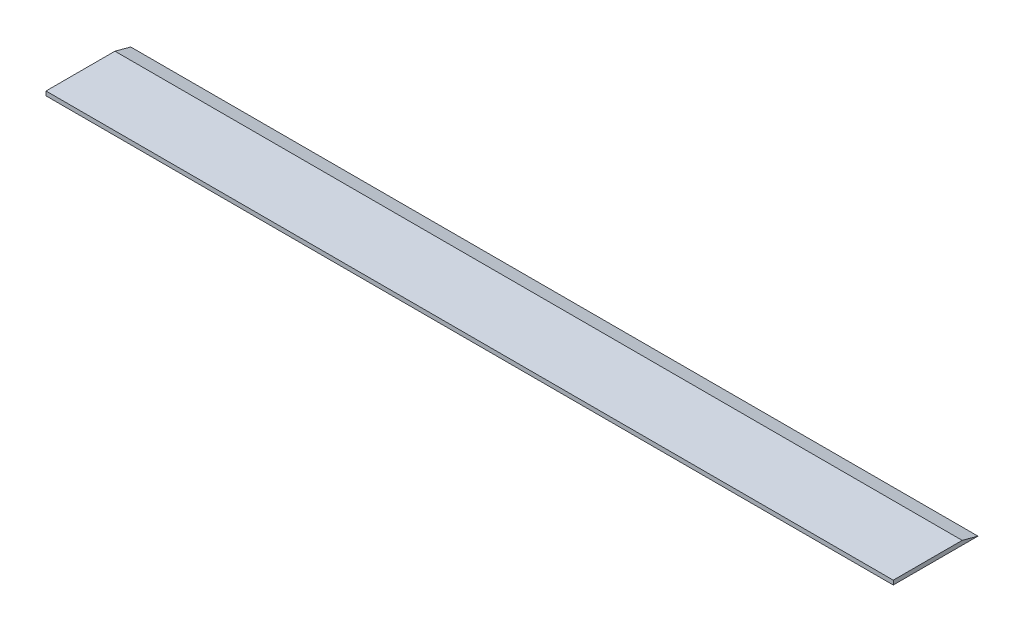
ISO-10303-21;
HEADER;
FILE_DESCRIPTION(('STEP AP214'),'2;1');
FILE_NAME('part.step','',(''),(''),'','','');
FILE_SCHEMA(('AUTOMOTIVE_DESIGN { 1 0 10303 214 1 1 1 1 }'));
ENDSEC;
DATA;
#1=APPLICATION_CONTEXT('core data for automotive mechanical design processes');
#2=APPLICATION_PROTOCOL_DEFINITION('international standard','automotive_design',2000,#1);
#3=PRODUCT_CONTEXT('',#1,'mechanical');
#4=PRODUCT('Part','Part','',(#3));
#5=PRODUCT_RELATED_PRODUCT_CATEGORY('part','',(#4));
#6=PRODUCT_DEFINITION_FORMATION('','',#4);
#7=PRODUCT_DEFINITION_CONTEXT('part definition',#1,'design');
#8=PRODUCT_DEFINITION('design','',#6,#7);
#9=PRODUCT_DEFINITION_SHAPE('','',#8);
#10=(LENGTH_UNIT() NAMED_UNIT(*) SI_UNIT(.MILLI.,.METRE.));
#11=(NAMED_UNIT(*) PLANE_ANGLE_UNIT() SI_UNIT($,.RADIAN.));
#12=(NAMED_UNIT(*) SI_UNIT($,.STERADIAN.) SOLID_ANGLE_UNIT());
#13=UNCERTAINTY_MEASURE_WITH_UNIT(LENGTH_MEASURE(1.E-05),#10,'distance_accuracy_value','');
#14=(GEOMETRIC_REPRESENTATION_CONTEXT(3) GLOBAL_UNCERTAINTY_ASSIGNED_CONTEXT((#13)) GLOBAL_UNIT_ASSIGNED_CONTEXT((#10,
#11,#12)) REPRESENTATION_CONTEXT('',''));
#15=CARTESIAN_POINT('',(0.,0.,0.));
#16=DIRECTION('',(0.,0.,1.));
#17=DIRECTION('',(1.,0.,0.));
#18=AXIS2_PLACEMENT_3D('',#15,#16,#17);
#19=CARTESIAN_POINT('',(100.,1.,10.));
#20=DIRECTION('',(-1.,0.,0.));
#21=DIRECTION('',(0.,0.,1.));
#22=AXIS2_PLACEMENT_3D('',#19,#20,#21);
#23=PLANE('',#22);
#24=DIRECTION('',(0.,0.,-1.));
#25=VECTOR('',#24,1.);
#26=CARTESIAN_POINT('',(100.,0.,10.));
#27=LINE('',#26,#25);
#28=CARTESIAN_POINT('',(100.,0.,10.));
#29=VERTEX_POINT('',#28);
#30=CARTESIAN_POINT('',(100.,0.,-10.));
#31=VERTEX_POINT('',#30);
#32=EDGE_CURVE('E89',#29,#31,#27,.T.);
#33=ORIENTED_EDGE('',*,*,#32,.T.);
#34=DIRECTION('',(0.,-0.258819045102514,-0.96592582628907));
#35=VECTOR('',#34,1.);
#36=CARTESIAN_POINT('',(100.,2.49999999999994,-0.669872981077772));
#37=LINE('',#36,#35);
#38=CARTESIAN_POINT('',(100.,1.,-6.26794919243102));
#39=VERTEX_POINT('',#38);
#40=EDGE_CURVE('E116',#39,#31,#37,.T.);
#41=ORIENTED_EDGE('',*,*,#40,.F.);
#42=DIRECTION('',(0.,0.,-1.));
#43=VECTOR('',#42,1.);
#44=CARTESIAN_POINT('',(100.,1.,10.));
#45=LINE('',#44,#43);
#46=CARTESIAN_POINT('',(100.,1.,10.));
#47=VERTEX_POINT('',#46);
#48=EDGE_CURVE('E84',#47,#39,#45,.T.);
#49=ORIENTED_EDGE('',*,*,#48,.F.);
#50=DIRECTION('',(0.,-1.,0.));
#51=VECTOR('',#50,1.);
#52=CARTESIAN_POINT('',(100.,1.,10.));
#53=LINE('',#52,#51);
#54=EDGE_CURVE('E51',#47,#29,#53,.T.);
#55=ORIENTED_EDGE('',*,*,#54,.T.);
#56=EDGE_LOOP('',(#33,#41,#49,#55));
#57=FACE_BOUND('',#56,.T.);
#58=ADVANCED_FACE('F42',(#57),#23,.F.);
#59=CARTESIAN_POINT('',(-100.,1.,10.));
#60=DIRECTION('',(1.,0.,0.));
#61=DIRECTION('',(0.,0.,-1.));
#62=AXIS2_PLACEMENT_3D('',#59,#60,#61);
#63=PLANE('',#62);
#64=DIRECTION('',(0.,0.,1.));
#65=VECTOR('',#64,1.);
#66=CARTESIAN_POINT('',(-100.,1.,10.));
#67=LINE('',#66,#65);
#68=CARTESIAN_POINT('',(-100.,1.,-6.26794919243102));
#69=VERTEX_POINT('',#68);
#70=CARTESIAN_POINT('',(-100.,1.,10.));
#71=VERTEX_POINT('',#70);
#72=EDGE_CURVE('E110',#69,#71,#67,.T.);
#73=ORIENTED_EDGE('',*,*,#72,.F.);
#74=DIRECTION('',(0.,-0.258819045102514,-0.96592582628907));
#75=VECTOR('',#74,1.);
#76=CARTESIAN_POINT('',(-100.,2.49999999999994,-0.669872981077772));
#77=LINE('',#76,#75);
#78=CARTESIAN_POINT('',(-100.,0.,-10.));
#79=VERTEX_POINT('',#78);
#80=EDGE_CURVE('E102',#69,#79,#77,.T.);
#81=ORIENTED_EDGE('',*,*,#80,.T.);
#82=DIRECTION('',(0.,0.,1.));
#83=VECTOR('',#82,1.);
#84=CARTESIAN_POINT('',(-100.,0.,10.));
#85=LINE('',#84,#83);
#86=CARTESIAN_POINT('',(-100.,0.,10.));
#87=VERTEX_POINT('',#86);
#88=EDGE_CURVE('E73',#79,#87,#85,.T.);
#89=ORIENTED_EDGE('',*,*,#88,.T.);
#90=DIRECTION('',(0.,-1.,0.));
#91=VECTOR('',#90,1.);
#92=CARTESIAN_POINT('',(-100.,1.,10.));
#93=LINE('',#92,#91);
#94=EDGE_CURVE('E11',#71,#87,#93,.T.);
#95=ORIENTED_EDGE('',*,*,#94,.F.);
#96=EDGE_LOOP('',(#73,#81,#89,#95));
#97=FACE_BOUND('',#96,.T.);
#98=ADVANCED_FACE('F121',(#97),#63,.F.);
#99=CARTESIAN_POINT('',(-100.,1.,10.));
#100=DIRECTION('',(0.,0.,-1.));
#101=DIRECTION('',(-1.,0.,0.));
#102=AXIS2_PLACEMENT_3D('',#99,#100,#101);
#103=PLANE('',#102);
#104=DIRECTION('',(1.,0.,0.));
#105=VECTOR('',#104,1.);
#106=CARTESIAN_POINT('',(-100.,0.,10.));
#107=LINE('',#106,#105);
#108=EDGE_CURVE('E77',#87,#29,#107,.T.);
#109=ORIENTED_EDGE('',*,*,#108,.T.);
#110=ORIENTED_EDGE('',*,*,#54,.F.);
#111=DIRECTION('',(1.,0.,0.));
#112=VECTOR('',#111,1.);
#113=CARTESIAN_POINT('',(-100.,1.,10.));
#114=LINE('',#113,#112);
#115=EDGE_CURVE('E59',#71,#47,#114,.T.);
#116=ORIENTED_EDGE('',*,*,#115,.F.);
#117=ORIENTED_EDGE('',*,*,#94,.T.);
#118=EDGE_LOOP('',(#109,#110,#116,#117));
#119=FACE_BOUND('',#118,.T.);
#120=ADVANCED_FACE('F79',(#119),#103,.F.);
#121=CARTESIAN_POINT('',(0.,1.,0.));
#122=DIRECTION('',(0.,-1.,0.));
#123=DIRECTION('',(0.,0.,-1.));
#124=AXIS2_PLACEMENT_3D('',#121,#122,#123);
#125=PLANE('',#124);
#126=ORIENTED_EDGE('',*,*,#48,.T.);
#127=DIRECTION('',(1.,0.,0.));
#128=VECTOR('',#127,1.);
#129=CARTESIAN_POINT('',(-100.,1.,-6.26794919243102));
#130=LINE('',#129,#128);
#131=EDGE_CURVE('E96',#69,#39,#130,.T.);
#132=ORIENTED_EDGE('',*,*,#131,.F.);
#133=ORIENTED_EDGE('',*,*,#72,.T.);
#134=ORIENTED_EDGE('',*,*,#115,.T.);
#135=EDGE_LOOP('',(#126,#132,#133,#134));
#136=FACE_BOUND('',#135,.T.);
#137=ADVANCED_FACE('F128',(#136),#125,.F.);
#138=CARTESIAN_POINT('',(0.,0.,0.));
#139=DIRECTION('',(0.,-1.,0.));
#140=DIRECTION('',(0.,0.,-1.));
#141=AXIS2_PLACEMENT_3D('',#138,#139,#140);
#142=PLANE('',#141);
#143=ORIENTED_EDGE('',*,*,#32,.F.);
#144=ORIENTED_EDGE('',*,*,#108,.F.);
#145=ORIENTED_EDGE('',*,*,#88,.F.);
#146=DIRECTION('',(-1.,0.,0.));
#147=VECTOR('',#146,1.);
#148=CARTESIAN_POINT('',(-100.,0.,-10.));
#149=LINE('',#148,#147);
#150=EDGE_CURVE('E94',#31,#79,#149,.T.);
#151=ORIENTED_EDGE('',*,*,#150,.F.);
#152=EDGE_LOOP('',(#143,#144,#145,#151));
#153=FACE_BOUND('',#152,.T.);
#154=ADVANCED_FACE('F92',(#153),#142,.T.);
#155=CARTESIAN_POINT('',(-100.,2.49999999999994,-0.669872981077772));
#156=DIRECTION('',(0.,-0.96592582628907,0.258819045102514));
#157=DIRECTION('',(0.,-0.258819045102514,-0.96592582628907));
#158=AXIS2_PLACEMENT_3D('',#155,#156,#157);
#159=PLANE('',#158);
#160=ORIENTED_EDGE('',*,*,#40,.T.);
#161=ORIENTED_EDGE('',*,*,#150,.T.);
#162=ORIENTED_EDGE('',*,*,#80,.F.);
#163=ORIENTED_EDGE('',*,*,#131,.T.);
#164=EDGE_LOOP('',(#160,#161,#162,#163));
#165=FACE_BOUND('',#164,.T.);
#166=ADVANCED_FACE('F125',(#165),#159,.F.);
#167=CLOSED_SHELL('',(#58,#98,#120,#137,#154,#166));
#168=MANIFOLD_SOLID_BREP('B2',#167);
#169=ADVANCED_BREP_SHAPE_REPRESENTATION('',(#18,#168),#14);
#170=SHAPE_DEFINITION_REPRESENTATION(#9,#169);
ENDSEC;
END-ISO-10303-21;
